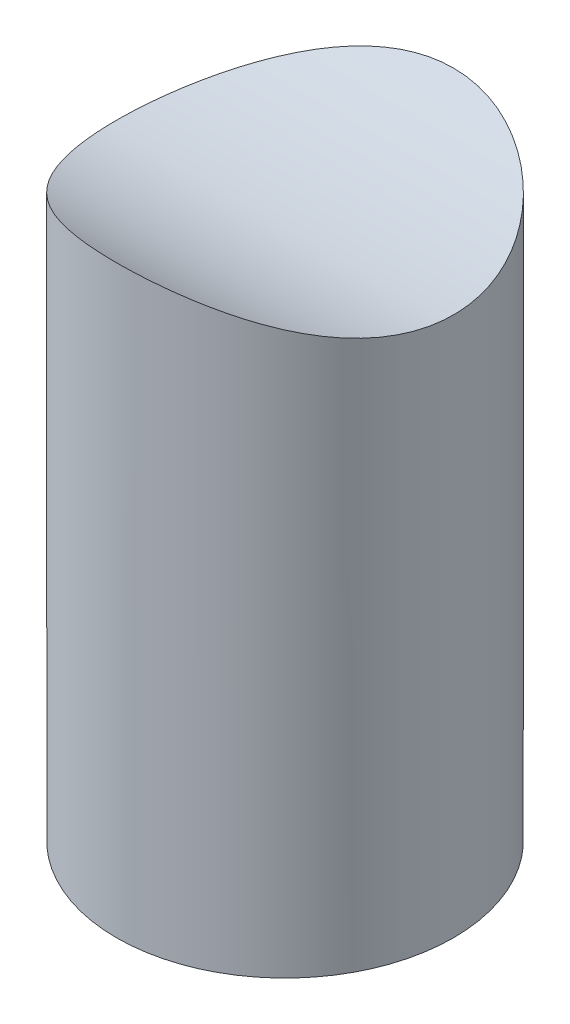
ISO-10303-21;
HEADER;
FILE_DESCRIPTION(('STEP AP214'),'2;1');
FILE_NAME('part.step','',(''),(''),'','','');
FILE_SCHEMA(('AUTOMOTIVE_DESIGN { 1 0 10303 214 1 1 1 1 }'));
ENDSEC;
DATA;
#1=APPLICATION_CONTEXT('core data for automotive mechanical design processes');
#2=APPLICATION_PROTOCOL_DEFINITION('international standard','automotive_design',2000,#1);
#3=PRODUCT_CONTEXT('',#1,'mechanical');
#4=PRODUCT('Part','Part','',(#3));
#5=PRODUCT_RELATED_PRODUCT_CATEGORY('part','',(#4));
#6=PRODUCT_DEFINITION_FORMATION('','',#4);
#7=PRODUCT_DEFINITION_CONTEXT('part definition',#1,'design');
#8=PRODUCT_DEFINITION('design','',#6,#7);
#9=PRODUCT_DEFINITION_SHAPE('','',#8);
#10=(LENGTH_UNIT() NAMED_UNIT(*) SI_UNIT(.MILLI.,.METRE.));
#11=(NAMED_UNIT(*) PLANE_ANGLE_UNIT() SI_UNIT($,.RADIAN.));
#12=(NAMED_UNIT(*) SI_UNIT($,.STERADIAN.) SOLID_ANGLE_UNIT());
#13=UNCERTAINTY_MEASURE_WITH_UNIT(LENGTH_MEASURE(1.E-05),#10,'distance_accuracy_value','');
#14=(GEOMETRIC_REPRESENTATION_CONTEXT(3) GLOBAL_UNCERTAINTY_ASSIGNED_CONTEXT((#13)) GLOBAL_UNIT_ASSIGNED_CONTEXT((#10,
#11,#12)) REPRESENTATION_CONTEXT('',''));
#15=CARTESIAN_POINT('',(0.,0.,0.));
#16=DIRECTION('',(0.,0.,1.));
#17=DIRECTION('',(1.,0.,0.));
#18=AXIS2_PLACEMENT_3D('',#15,#16,#17);
#19=CARTESIAN_POINT('',(0.,50.,0.));
#20=DIRECTION('',(0.,-1.,0.));
#21=DIRECTION('',(0.,0.,-1.));
#22=AXIS2_PLACEMENT_3D('',#19,#20,#21);
#23=CYLINDRICAL_SURFACE('',#22,25.);
#24=CARTESIAN_POINT('',(0.,36.6987298107781,-25.));
#25=CARTESIAN_POINT('',(0.651657728078345,36.6987261025986,-24.9999972492967));
#26=CARTESIAN_POINT('',(1.30337199528604,36.6839689756162,-24.9744865840936));
#27=CARTESIAN_POINT('',(2.60177863889863,36.6254882789234,-24.8727781222585));
#28=CARTESIAN_POINT('',(3.24846853548874,36.5817512238793,-24.7965567281536));
#29=CARTESIAN_POINT('',(4.53272868796324,36.4668426423674,-24.594261965626));
#30=CARTESIAN_POINT('',(5.17027999705686,36.3956208385859,-24.4680972258423));
#31=CARTESIAN_POINT('',(6.43045471544741,36.2283123816507,-24.1675168252073));
#32=CARTESIAN_POINT('',(7.0530795491345,36.1322281114528,-23.9931057884363));
#33=CARTESIAN_POINT('',(8.2762885876815,35.9189827080562,-23.599020492088));
#34=CARTESIAN_POINT('',(8.87697298138665,35.8019372193278,-23.3795936665704));
#35=CARTESIAN_POINT('',(10.0565840143935,35.549996921812,-22.8969708071432));
#36=CARTESIAN_POINT('',(10.6355102011031,35.415101741997,-22.6337738633895));
#37=CARTESIAN_POINT('',(11.7687683585691,35.1312695009909,-22.0657597161742));
#38=CARTESIAN_POINT('',(12.3231060045315,34.9823357050714,-21.7609521836511));
#39=CARTESIAN_POINT('',(13.405222067322,34.6741705319533,-21.1115697238676));
#40=CARTESIAN_POINT('',(13.9329906242587,34.5149353812491,-20.766980187319));
#41=CARTESIAN_POINT('',(15.0020081204318,34.1766173679762,-20.0100786450758));
#42=CARTESIAN_POINT('',(15.5407899017115,33.9969797462371,-19.5945268058562));
#43=CARTESIAN_POINT('',(16.5821820892583,33.634815066389,-18.7214577237365));
#44=CARTESIAN_POINT('',(17.0847906143755,33.4522878586115,-18.2639383011691));
#45=CARTESIAN_POINT('',(18.0517317034124,33.0887628615613,-17.3088715339642));
#46=CARTESIAN_POINT('',(18.5160391270901,32.9077661457304,-16.8112983153376));
#47=CARTESIAN_POINT('',(19.403358645631,32.5518682561003,-15.778873095701));
#48=CARTESIAN_POINT('',(19.8263845601862,32.3769650550876,-15.2440336736723));
#49=CARTESIAN_POINT('',(20.6559103346768,32.0258823325266,-14.101935890209));
#50=CARTESIAN_POINT('',(21.059348132888,31.8504193713059,-13.4922260925484));
#51=CARTESIAN_POINT('',(21.8130164090103,31.5160479321667,-12.2363642027715));
#52=CARTESIAN_POINT('',(22.1632438315922,31.3571404050224,-11.5902100209449));
#53=CARTESIAN_POINT('',(22.8068723133523,31.0605284780178,-10.2658796175507));
#54=CARTESIAN_POINT('',(23.1003009240628,30.9228138047695,-9.58771912093295));
#55=CARTESIAN_POINT('',(23.6271574422266,30.6726366795323,-8.20398216536625));
#56=CARTESIAN_POINT('',(23.8605917227733,30.5601715454893,-7.49840862763116));
#57=CARTESIAN_POINT('',(24.2500719399282,30.3709847462374,-6.11654042575088));
#58=CARTESIAN_POINT('',(24.410441753632,30.2922895289724,-5.44173347042513));
#59=CARTESIAN_POINT('',(24.6748266692845,30.1619241405472,-4.07858290347345));
#60=CARTESIAN_POINT('',(24.7788442214104,30.1102527944017,-3.3902398817399));
#61=CARTESIAN_POINT('',(24.9290995504173,30.0354549880615,-2.00608536322839));
#62=CARTESIAN_POINT('',(24.9753667718625,30.0123139814713,-1.31027785496801));
#63=CARTESIAN_POINT('',(25.0095715600164,29.9952160018062,0.0831103975767522));
#64=CARTESIAN_POINT('',(24.9975126954156,30.0012572432109,0.780691030762019));
#65=CARTESIAN_POINT('',(24.9188401315975,30.0405402241611,2.11091341143743));
#66=CARTESIAN_POINT('',(24.8570687182852,30.0713674296043,2.7439201254428));
#67=CARTESIAN_POINT('',(24.6857933574407,30.1564160837605,4.00180573261866));
#68=CARTESIAN_POINT('',(24.576292770444,30.210635885435,4.62668519482671));
#69=CARTESIAN_POINT('',(24.3107512890051,30.3411711849769,5.86411664160768));
#70=CARTESIAN_POINT('',(24.1547088784611,30.4174874026335,6.47666822390543));
#71=CARTESIAN_POINT('',(23.7976713405259,30.5904383253924,7.68557846708671));
#72=CARTESIAN_POINT('',(23.5966745985519,30.6870737602736,8.28193654550033));
#73=CARTESIAN_POINT('',(23.1485341467428,30.8999467420228,9.46307781020892));
#74=CARTESIAN_POINT('',(22.9007934938713,31.0164357243216,10.0475888012673));
#75=CARTESIAN_POINT('',(22.3631542092352,31.2654750512679,11.1932924970822));
#76=CARTESIAN_POINT('',(22.073255627975,31.3980253766742,11.7544852297725));
#77=CARTESIAN_POINT('',(21.4533967659483,31.6763873478711,12.8510127622086));
#78=CARTESIAN_POINT('',(21.1234266116358,31.8222022597963,13.3863411434307));
#79=CARTESIAN_POINT('',(20.4256190341222,32.1240461524665,14.4287052512528));
#80=CARTESIAN_POINT('',(20.0577785424352,32.2800759605113,14.9357386800821));
#81=CARTESIAN_POINT('',(19.2498172622248,32.6142670940713,15.9659829272969));
#82=CARTESIAN_POINT('',(18.8061507663467,32.7931261219761,16.4861908868765));
#83=CARTESIAN_POINT('',(17.878545130929,33.154936561063,17.4878151609516));
#84=CARTESIAN_POINT('',(17.3946036999607,33.3378882046596,17.9692292652126));
#85=CARTESIAN_POINT('',(16.3884818333071,33.7035357082442,18.8913612335406));
#86=CARTESIAN_POINT('',(15.8662738391005,33.8862312853802,19.3320492409618));
#87=CARTESIAN_POINT('',(15.0565544991401,34.156406045986,19.9603840123244));
#88=CARTESIAN_POINT('',(14.7822362181157,34.2458227600843,20.1643863204588));
#89=CARTESIAN_POINT('',(14.2249760149928,34.4228115349913,20.5613013775411));
#90=CARTESIAN_POINT('',(13.942031409767,34.510383007234,20.7542106211332));
#91=CARTESIAN_POINT('',(13.0443742119748,34.7803508729143,21.339529527128));
#92=CARTESIAN_POINT('',(12.415048704098,34.9584168937474,21.7118230929146));
#93=CARTESIAN_POINT('',(11.1225584877746,35.2973969305219,22.401452093898));
#94=CARTESIAN_POINT('',(10.4593967999659,35.4583124735802,22.7187924238286));
#95=CARTESIAN_POINT('',(9.4426682570212,35.6823436783398,23.1510609956445));
#96=CARTESIAN_POINT('',(9.10016001198919,35.7541186823523,23.2878388705815));
#97=CARTESIAN_POINT('',(8.40838786333441,35.8912026145165,23.5464514655133));
#98=CARTESIAN_POINT('',(8.05912571077177,35.956513192505,23.6682900002));
#99=CARTESIAN_POINT('',(7.00201342033251,36.1417325266693,24.0108330854159));
#100=CARTESIAN_POINT('',(6.28464457283938,36.250972021935,24.2086472902985));
#101=CARTESIAN_POINT('',(4.88870901344563,36.4286946225223,24.5269620029075));
#102=CARTESIAN_POINT('',(4.2115687336296,36.4997203401479,24.6523447935619));
#103=CARTESIAN_POINT('',(2.84669344068969,36.6105848453035,24.8469575763003));
#104=CARTESIAN_POINT('',(2.15895902852085,36.6504253952266,24.916190741622));
#105=CARTESIAN_POINT('',(0.779421212571226,36.6971996903436,24.9973937987513));
#106=CARTESIAN_POINT('',(0.0876205201857685,36.7041533156759,25.0093982853171));
#107=CARTESIAN_POINT('',(-1.29410670579054,36.6849027500128,24.9760435062342));
#108=CARTESIAN_POINT('',(-1.98403336273574,36.6587007971504,24.9306881126047));
#109=CARTESIAN_POINT('',(-3.28055256398141,36.5789206619604,24.7914377927162));
#110=CARTESIAN_POINT('',(-3.88799241923916,36.5286569726158,24.7034064080223));
#111=CARTESIAN_POINT('',(-5.09235719600757,36.4044338183366,24.4835158457237));
#112=CARTESIAN_POINT('',(-5.68928304348072,36.33047645121,24.3516605481936));
#113=CARTESIAN_POINT('',(-6.86915997755551,36.1611554287495,24.0455037172597));
#114=CARTESIAN_POINT('',(-7.45210761033613,36.0657865420406,23.8711918097489));
#115=CARTESIAN_POINT('',(-8.60077796778291,35.8564345612246,23.4817897713769));
#116=CARTESIAN_POINT('',(-9.16649963911455,35.7424503315261,23.2666971526418));
#117=CARTESIAN_POINT('',(-10.3036310513174,35.4933375015648,22.7866934178468));
#118=CARTESIAN_POINT('',(-10.8741040265233,35.3574771407708,22.5199449130061));
#119=CARTESIAN_POINT('',(-11.9909294700446,35.0723841037274,21.9456625079577));
#120=CARTESIAN_POINT('',(-12.5372714883265,34.9231457171881,21.6381111642824));
#121=CARTESIAN_POINT('',(-13.6034940304572,34.6150412233255,20.9841879069052));
#122=CARTESIAN_POINT('',(-14.1233692262792,34.456173191452,20.6378082212681));
#123=CARTESIAN_POINT('',(-15.1345879150036,34.1325142915471,19.9081156666699));
#124=CARTESIAN_POINT('',(-15.625929372136,33.9677230022691,19.5248001676595));
#125=CARTESIAN_POINT('',(-16.6383010122432,33.6148685530488,18.6723933753344));
#126=CARTESIAN_POINT('',(-17.1552571745104,33.426492131722,18.1985814957771));
#127=CARTESIAN_POINT('',(-18.1479612677744,33.0517604916509,17.208801457832));
#128=CARTESIAN_POINT('',(-18.6237060214299,32.8654054297178,16.6928300549538));
#129=CARTESIAN_POINT('',(-19.5313825427206,32.499448967224,15.6210867099589));
#130=CARTESIAN_POINT('',(-19.9632988201806,32.3198499684547,15.0653008138923));
#131=CARTESIAN_POINT('',(-20.78021650138,31.9720832829254,13.9168654136765));
#132=CARTESIAN_POINT('',(-21.1652183667226,31.8039154836981,13.324216272321));
#133=CARTESIAN_POINT('',(-21.8948385164209,31.4791344826443,12.0890056860871));
#134=CARTESIAN_POINT('',(-22.2381140666933,31.3229463148222,11.445537083859));
#135=CARTESIAN_POINT('',(-22.8686774667118,31.0316613594952,10.1270695634352));
#136=CARTESIAN_POINT('',(-23.1559634400449,30.8965652788924,9.45206958944887));
#137=CARTESIAN_POINT('',(-23.6710809469709,30.6515577149652,8.07584855033876));
#138=CARTESIAN_POINT('',(-23.8989549518689,30.5416282478999,7.37464662821719));
#139=CARTESIAN_POINT('',(-24.2925476674675,30.3502443117737,5.9512332801707));
#140=CARTESIAN_POINT('',(-24.458273748637,30.2687864661823,5.2290243565372));
#141=CARTESIAN_POINT('',(-24.7129738270469,30.1430040953368,3.83701251064257));
#142=CARTESIAN_POINT('',(-24.8075966684247,30.0959573797875,3.16848428122954));
#143=CARTESIAN_POINT('',(-24.9424667472851,30.0287763633864,1.82462999197065));
#144=CARTESIAN_POINT('',(-24.9827174357542,30.0086403545197,1.14930436629496));
#145=CARTESIAN_POINT('',(-25.0083162364952,29.9958425078584,-0.202439854909067));
#146=CARTESIAN_POINT('',(-24.9936807058504,30.003172484704,-0.878858064769213));
#147=CARTESIAN_POINT('',(-24.9097358222379,30.045084252977,-2.2274289191176));
#148=CARTESIAN_POINT('',(-24.8404279743976,30.0796652941833,-2.89958168052001));
#149=CARTESIAN_POINT('',(-24.6543998024786,30.1719616011681,-4.19012849545485));
#150=CARTESIAN_POINT('',(-24.5411116057829,30.2279988838988,-4.80914210853196));
#151=CARTESIAN_POINT('',(-24.2688562352993,30.361674888653,-6.03461366863557));
#152=CARTESIAN_POINT('',(-24.109891640303,30.4393123911666,-6.64107232241653));
#153=CARTESIAN_POINT('',(-23.747849994662,30.6144222198107,-7.83775931737805));
#154=CARTESIAN_POINT('',(-23.5447695147136,30.7118960878638,-8.42798639279271));
#155=CARTESIAN_POINT('',(-23.0963397362171,30.9245279698234,-9.58886482620043));
#156=CARTESIAN_POINT('',(-22.8509884649227,31.0396868090471,-10.1595152690755));
#157=CARTESIAN_POINT('',(-22.308659364884,31.2904934383789,-11.3022392748832));
#158=CARTESIAN_POINT('',(-22.0099237661831,31.4268063688242,-11.8733321215653));
#159=CARTESIAN_POINT('',(-21.3709751726378,31.7129727314643,-12.9882367601858));
#160=CARTESIAN_POINT('',(-21.030761401556,31.8628264170521,-13.5320480412983));
#161=CARTESIAN_POINT('',(-20.3110145040853,32.17289671205,-14.5901418631954));
#162=CARTESIAN_POINT('',(-19.9314678829649,32.3331168709701,-15.1044141747537));
#163=CARTESIAN_POINT('',(-19.135326866118,32.6604914915673,-16.1011229628171));
#164=CARTESIAN_POINT('',(-18.7187291259197,32.8276465785074,-16.5835565584942));
#165=CARTESIAN_POINT('',(-17.8073460558901,33.1821806432338,-17.5609868614201));
#166=CARTESIAN_POINT('',(-17.3089057811131,33.369916199584,-18.0524521311882));
#167=CARTESIAN_POINT('',(-16.2724114852239,33.7446443098905,-18.9920498989603));
#168=CARTESIAN_POINT('',(-15.7343545615363,33.9316368083456,-19.4401792163128));
#169=CARTESIAN_POINT('',(-14.6207785923102,34.2999911426038,-20.2909910624585));
#170=CARTESIAN_POINT('',(-14.0452252134736,34.4813475869012,-20.6936309903305));
#171=CARTESIAN_POINT('',(-12.859787725171,34.8330431841976,-21.4504110417563));
#172=CARTESIAN_POINT('',(-12.2499062502337,35.0033831805097,-21.8045548800276));
#173=CARTESIAN_POINT('',(-11.3018607185228,35.2491913539471,-22.3024856266454));
#174=CARTESIAN_POINT('',(-10.9750333120999,35.3306788328363,-22.4651334968817));
#175=CARTESIAN_POINT('',(-10.3136429723918,35.4885623793838,-22.7763547859923));
#176=CARTESIAN_POINT('',(-9.97908184493878,35.5649596197617,-22.9249314500231));
#177=CARTESIAN_POINT('',(-8.96426144522223,35.7854960943882,-23.3490772961765));
#178=CARTESIAN_POINT('',(-8.2728835951333,35.9209752330292,-23.6030526309905));
#179=CARTESIAN_POINT('',(-6.8679429361277,36.1629021029258,-24.0493909122374));
#180=CARTESIAN_POINT('',(-6.15445136020555,36.2694340512237,-24.2419328799137));
#181=CARTESIAN_POINT('',(-4.70954394909074,36.4492598580344,-24.5635340961408));
#182=CARTESIAN_POINT('',(-3.97814102285206,36.5225769526243,-24.6926377295426));
#183=CARTESIAN_POINT('',(-2.70500982979901,36.6176231094708,-24.8591156657607));
#184=CARTESIAN_POINT('',(-2.16587885060813,36.6479641193964,-24.91189663269));
#185=CARTESIAN_POINT('',(-1.08451176835221,36.6885196861346,-24.9823411189456));
#186=CARTESIAN_POINT('',(-0.542275459994334,36.698732896531,-25.0000022889913));
#187=CARTESIAN_POINT('',(0.,36.6987298107781,-25.));
#188=B_SPLINE_CURVE_WITH_KNOTS('',3,(#24,#25,#26,#27,#28,#29,#30,#31,#32,#33,#34,#35,#36,#37,
#38,#39,#40,#41,#42,#43,#44,#45,#46,#47,#48,#49,#50,#51,#52,#53,#54,#55,#56,#57,#58,#59,#60,#61,
#62,#63,#64,#65,#66,#67,#68,#69,#70,#71,#72,#73,#74,#75,#76,#77,#78,#79,#80,#81,#82,#83,#84,#85,
#86,#87,#88,#89,#90,#91,#92,#93,#94,#95,#96,#97,#98,#99,#100,#101,#102,#103,#104,#105,#106,#107,
#108,#109,#110,#111,#112,#113,#114,#115,#116,#117,#118,#119,#120,#121,#122,#123,#124,#125,#126,
#127,#128,#129,#130,#131,#132,#133,#134,#135,#136,#137,#138,#139,#140,#141,#142,#143,#144,#145,
#146,#147,#148,#149,#150,#151,#152,#153,#154,#155,#156,#157,#158,#159,#160,#161,#162,#163,#164,
#165,#166,#167,#168,#169,#170,#171,#172,#173,#174,#175,#176,#177,#178,#179,#180,#181,#182,#183,
#184,#185,#186,#187),.UNSPECIFIED.,.T.,.F.,(4,2,2,2,2,2,2,2,2,2,2,2,2,2,2,2,2,2,2,2,2,2,2,2,2,2,
2,2,2,2,2,2,2,2,2,2,2,2,2,2,2,2,2,2,2,2,2,2,2,2,2,2,2,2,2,2,2,2,2,2,2,2,2,2,2,2,2,2,2,2,2,2,2,2,
2,2,2,2,2,2,2,4),(0.,1.95441192278272,3.90973393836879,5.86864987236744,7.8273781225633,
9.77561538455969,11.723893149394,13.6717188730885,15.620262192923,17.7292201070748,
19.8382876161037,21.9487286473746,24.0584607311283,26.3111473362998,28.5639632414418,
30.8156836143288,33.067164691916,35.1584826548101,37.2497096806103,39.339870037992,
41.4299025102114,43.3379272290007,45.2458176284876,47.153770184371,49.0617912774175,
50.9960675392925,52.9303414839626,54.8650930001226,56.8000014052271,58.9178481891629,
61.0358155497571,63.1553234931732,64.2151556831173,65.2753209551759,67.5299925667647,
69.7844632493247,70.9112804180447,72.0378092573376,74.2902273803598,76.3642610710997,
78.4381775418091,80.5108401701136,82.5833628929462,84.4287799170669,86.2740335954545,
88.1197386074929,89.9655562551281,91.8963352398348,93.8279423204728,95.7599367269954,
97.6920688048029,99.8679420645494,102.043982932003,104.220790212283,106.39757607266,
108.632125578475,110.866749959239,113.099772486652,115.332530103652,117.360339064742,
119.388019315274,121.415095328543,123.442115538416,125.335316614567,127.228410825634,
129.121652247157,131.014982048795,132.989197931268,134.9634507656,136.938383204219,
138.913494094206,141.085252835438,143.257170852589,145.431106304714,147.604875143848,
148.726679825932,149.848225159809,152.091379766987,154.327936660809,156.562926503801,
158.1891770497,159.815536377274),.UNSPECIFIED.);
#189=CARTESIAN_POINT('',(0.,36.6987298107781,-25.));
#190=VERTEX_POINT('',#189);
#191=EDGE_CURVE('E10',#190,#190,#188,.T.);
#192=ORIENTED_EDGE('',*,*,#191,.T.);
#193=EDGE_LOOP('',(#192));
#194=FACE_BOUND('',#193,.T.);
#195=CARTESIAN_POINT('',(0.,-50.,0.));
#196=DIRECTION('',(0.,1.,0.));
#197=DIRECTION('',(0.,0.,1.));
#198=AXIS2_PLACEMENT_3D('',#195,#196,#197);
#199=CIRCLE('',#198,25.);
#200=CARTESIAN_POINT('',(0.,-50.,25.));
#201=VERTEX_POINT('',#200);
#202=EDGE_CURVE('E42',#201,#201,#199,.T.);
#203=ORIENTED_EDGE('',*,*,#202,.T.);
#204=EDGE_LOOP('',(#203));
#205=FACE_BOUND('',#204,.T.);
#206=ADVANCED_FACE('F31',(#194,#205),#23,.T.);
#207=CARTESIAN_POINT('',(0.,-50.,0.));
#208=DIRECTION('',(0.,1.,0.));
#209=DIRECTION('',(0.,0.,1.));
#210=AXIS2_PLACEMENT_3D('',#207,#208,#209);
#211=PLANE('',#210);
#212=ORIENTED_EDGE('',*,*,#202,.F.);
#213=EDGE_LOOP('',(#212));
#214=FACE_BOUND('',#213,.T.);
#215=ADVANCED_FACE('F49',(#214),#211,.F.);
#216=CARTESIAN_POINT('',(-25.,80.,0.));
#217=DIRECTION('',(1.,0.,0.));
#218=DIRECTION('',(0.,0.,-1.));
#219=AXIS2_PLACEMENT_3D('',#216,#217,#218);
#220=CYLINDRICAL_SURFACE('',#219,50.);
#221=ORIENTED_EDGE('',*,*,#191,.F.);
#222=EDGE_LOOP('',(#221));
#223=FACE_BOUND('',#222,.T.);
#224=ADVANCED_FACE('F51',(#223),#220,.F.);
#225=CLOSED_SHELL('',(#206,#215,#224));
#226=MANIFOLD_SOLID_BREP('B2',#225);
#227=ADVANCED_BREP_SHAPE_REPRESENTATION('',(#18,#226),#14);
#228=SHAPE_DEFINITION_REPRESENTATION(#9,#227);
ENDSEC;
END-ISO-10303-21;
